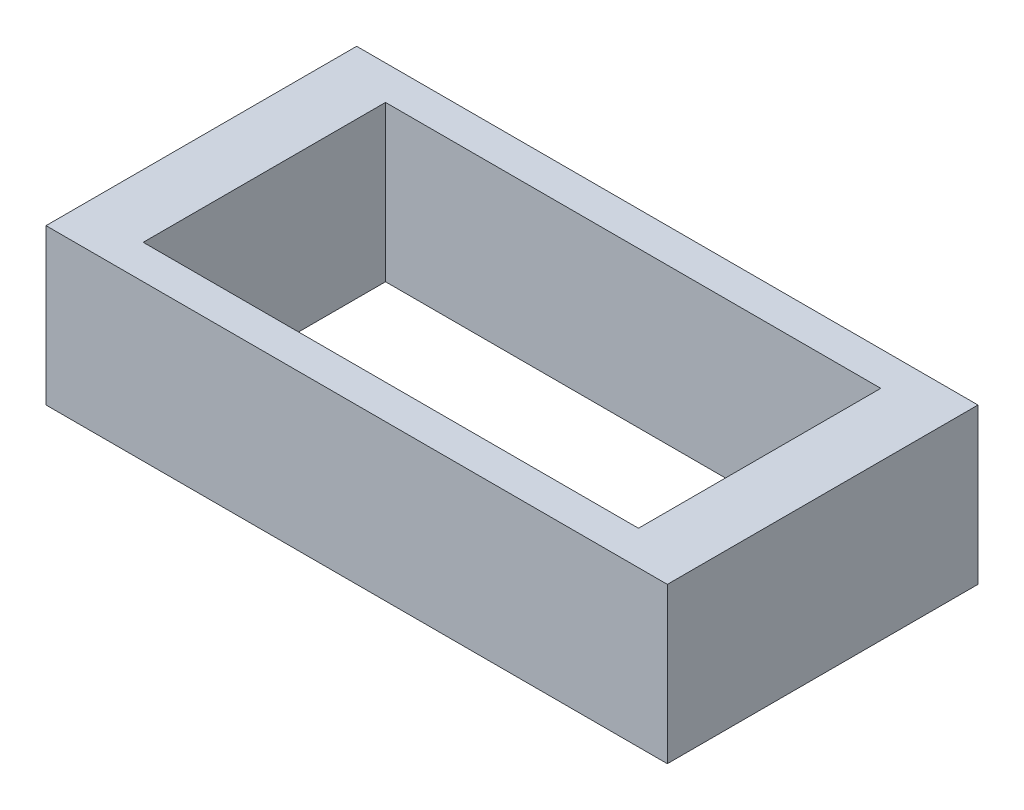
ISO-10303-21;
HEADER;
FILE_DESCRIPTION(('STEP AP214'),'2;1');
FILE_NAME('part.step','',(''),(''),'','','');
FILE_SCHEMA(('AUTOMOTIVE_DESIGN { 1 0 10303 214 1 1 1 1 }'));
ENDSEC;
DATA;
#1=APPLICATION_CONTEXT('core data for automotive mechanical design processes');
#2=APPLICATION_PROTOCOL_DEFINITION('international standard','automotive_design',2000,#1);
#3=PRODUCT_CONTEXT('',#1,'mechanical');
#4=PRODUCT('Part','Part','',(#3));
#5=PRODUCT_RELATED_PRODUCT_CATEGORY('part','',(#4));
#6=PRODUCT_DEFINITION_FORMATION('','',#4);
#7=PRODUCT_DEFINITION_CONTEXT('part definition',#1,'design');
#8=PRODUCT_DEFINITION('design','',#6,#7);
#9=PRODUCT_DEFINITION_SHAPE('','',#8);
#10=(LENGTH_UNIT() NAMED_UNIT(*) SI_UNIT(.MILLI.,.METRE.));
#11=(NAMED_UNIT(*) PLANE_ANGLE_UNIT() SI_UNIT($,.RADIAN.));
#12=(NAMED_UNIT(*) SI_UNIT($,.STERADIAN.) SOLID_ANGLE_UNIT());
#13=UNCERTAINTY_MEASURE_WITH_UNIT(LENGTH_MEASURE(1.E-05),#10,'distance_accuracy_value','');
#14=(GEOMETRIC_REPRESENTATION_CONTEXT(3) GLOBAL_UNCERTAINTY_ASSIGNED_CONTEXT((#13)) GLOBAL_UNIT_ASSIGNED_CONTEXT((#10,
#11,#12)) REPRESENTATION_CONTEXT('',''));
#15=CARTESIAN_POINT('',(0.,0.,0.));
#16=DIRECTION('',(0.,0.,1.));
#17=DIRECTION('',(1.,0.,0.));
#18=AXIS2_PLACEMENT_3D('',#15,#16,#17);
#19=CARTESIAN_POINT('',(0.,12.7,0.));
#20=DIRECTION('',(0.,-1.,0.));
#21=DIRECTION('',(0.,0.,-1.));
#22=AXIS2_PLACEMENT_3D('',#19,#20,#21);
#23=PLANE('',#22);
#24=DIRECTION('',(0.,0.,1.));
#25=VECTOR('',#24,1.);
#26=CARTESIAN_POINT('',(0.,12.7,0.));
#27=LINE('',#26,#25);
#28=CARTESIAN_POINT('',(0.,12.7,-25.4));
#29=VERTEX_POINT('',#28);
#30=CARTESIAN_POINT('',(0.,12.7,0.));
#31=VERTEX_POINT('',#30);
#32=EDGE_CURVE('E134',#29,#31,#27,.T.);
#33=ORIENTED_EDGE('',*,*,#32,.T.);
#34=DIRECTION('',(1.,0.,0.));
#35=VECTOR('',#34,1.);
#36=CARTESIAN_POINT('',(0.,12.7,0.));
#37=LINE('',#36,#35);
#38=CARTESIAN_POINT('',(50.8,12.7,0.));
#39=VERTEX_POINT('',#38);
#40=EDGE_CURVE('E137',#31,#39,#37,.T.);
#41=ORIENTED_EDGE('',*,*,#40,.T.);
#42=DIRECTION('',(0.,0.,-1.));
#43=VECTOR('',#42,1.);
#44=CARTESIAN_POINT('',(50.8,12.7,-25.4));
#45=LINE('',#44,#43);
#46=CARTESIAN_POINT('',(50.8,12.7,-25.4));
#47=VERTEX_POINT('',#46);
#48=EDGE_CURVE('E140',#39,#47,#45,.T.);
#49=ORIENTED_EDGE('',*,*,#48,.T.);
#50=DIRECTION('',(-1.,0.,0.));
#51=VECTOR('',#50,1.);
#52=CARTESIAN_POINT('',(0.,12.7,-25.4));
#53=LINE('',#52,#51);
#54=EDGE_CURVE('E142',#47,#29,#53,.T.);
#55=ORIENTED_EDGE('',*,*,#54,.T.);
#56=EDGE_LOOP('',(#33,#41,#49,#55));
#57=FACE_BOUND('',#56,.T.);
#58=DIRECTION('',(-1.,0.,0.));
#59=VECTOR('',#58,1.);
#60=CARTESIAN_POINT('',(5.15431678641298,12.7,-22.606));
#61=LINE('',#60,#59);
#62=CARTESIAN_POINT('',(45.645683213587,12.7,-22.606));
#63=VERTEX_POINT('',#62);
#64=CARTESIAN_POINT('',(5.15431678641298,12.7,-22.606));
#65=VERTEX_POINT('',#64);
#66=EDGE_CURVE('E98',#63,#65,#61,.T.);
#67=ORIENTED_EDGE('',*,*,#66,.F.);
#68=DIRECTION('',(0.,0.,-1.));
#69=VECTOR('',#68,1.);
#70=CARTESIAN_POINT('',(45.645683213587,12.7,-22.606));
#71=LINE('',#70,#69);
#72=CARTESIAN_POINT('',(45.645683213587,12.7,-2.794));
#73=VERTEX_POINT('',#72);
#74=EDGE_CURVE('E120',#73,#63,#71,.T.);
#75=ORIENTED_EDGE('',*,*,#74,.F.);
#76=DIRECTION('',(1.,0.,0.));
#77=VECTOR('',#76,1.);
#78=CARTESIAN_POINT('',(45.645683213587,12.7,-2.794));
#79=LINE('',#78,#77);
#80=CARTESIAN_POINT('',(5.15431678641298,12.7,-2.794));
#81=VERTEX_POINT('',#80);
#82=EDGE_CURVE('E118',#81,#73,#79,.T.);
#83=ORIENTED_EDGE('',*,*,#82,.F.);
#84=DIRECTION('',(0.,0.,1.));
#85=VECTOR('',#84,1.);
#86=CARTESIAN_POINT('',(5.15431678641298,12.7,-22.606));
#87=LINE('',#86,#85);
#88=EDGE_CURVE('E106',#65,#81,#87,.T.);
#89=ORIENTED_EDGE('',*,*,#88,.F.);
#90=EDGE_LOOP('',(#67,#75,#83,#89));
#91=FACE_BOUND('',#90,.T.);
#92=ADVANCED_FACE('F33',(#57,#91),#23,.F.);
#93=CARTESIAN_POINT('',(0.,0.,0.));
#94=DIRECTION('',(0.,-1.,0.));
#95=DIRECTION('',(0.,0.,-1.));
#96=AXIS2_PLACEMENT_3D('',#93,#94,#95);
#97=PLANE('',#96);
#98=DIRECTION('',(0.,0.,1.));
#99=VECTOR('',#98,1.);
#100=CARTESIAN_POINT('',(0.,0.,0.));
#101=LINE('',#100,#99);
#102=CARTESIAN_POINT('',(0.,0.,-25.4));
#103=VERTEX_POINT('',#102);
#104=CARTESIAN_POINT('',(0.,0.,0.));
#105=VERTEX_POINT('',#104);
#106=EDGE_CURVE('E114',#103,#105,#101,.T.);
#107=ORIENTED_EDGE('',*,*,#106,.F.);
#108=DIRECTION('',(-1.,0.,0.));
#109=VECTOR('',#108,1.);
#110=CARTESIAN_POINT('',(0.,0.,-25.4));
#111=LINE('',#110,#109);
#112=CARTESIAN_POINT('',(50.8,0.,-25.4));
#113=VERTEX_POINT('',#112);
#114=EDGE_CURVE('E138',#113,#103,#111,.T.);
#115=ORIENTED_EDGE('',*,*,#114,.F.);
#116=DIRECTION('',(0.,0.,-1.));
#117=VECTOR('',#116,1.);
#118=CARTESIAN_POINT('',(50.8,0.,-25.4));
#119=LINE('',#118,#117);
#120=CARTESIAN_POINT('',(50.8,0.,0.));
#121=VERTEX_POINT('',#120);
#122=EDGE_CURVE('E149',#121,#113,#119,.T.);
#123=ORIENTED_EDGE('',*,*,#122,.F.);
#124=DIRECTION('',(1.,0.,0.));
#125=VECTOR('',#124,1.);
#126=CARTESIAN_POINT('',(0.,0.,0.));
#127=LINE('',#126,#125);
#128=EDGE_CURVE('E147',#105,#121,#127,.T.);
#129=ORIENTED_EDGE('',*,*,#128,.F.);
#130=EDGE_LOOP('',(#107,#115,#123,#129));
#131=FACE_BOUND('',#130,.T.);
#132=DIRECTION('',(0.,0.,-1.));
#133=VECTOR('',#132,1.);
#134=CARTESIAN_POINT('',(45.645683213587,0.,-22.606));
#135=LINE('',#134,#133);
#136=CARTESIAN_POINT('',(45.645683213587,0.,-2.794));
#137=VERTEX_POINT('',#136);
#138=CARTESIAN_POINT('',(45.645683213587,0.,-22.606));
#139=VERTEX_POINT('',#138);
#140=EDGE_CURVE('E107',#137,#139,#135,.T.);
#141=ORIENTED_EDGE('',*,*,#140,.T.);
#142=DIRECTION('',(-1.,0.,0.));
#143=VECTOR('',#142,1.);
#144=CARTESIAN_POINT('',(5.15431678641298,0.,-22.606));
#145=LINE('',#144,#143);
#146=CARTESIAN_POINT('',(5.15431678641298,0.,-22.606));
#147=VERTEX_POINT('',#146);
#148=EDGE_CURVE('E56',#139,#147,#145,.T.);
#149=ORIENTED_EDGE('',*,*,#148,.T.);
#150=DIRECTION('',(0.,0.,1.));
#151=VECTOR('',#150,1.);
#152=CARTESIAN_POINT('',(5.15431678641298,0.,-22.606));
#153=LINE('',#152,#151);
#154=CARTESIAN_POINT('',(5.15431678641298,0.,-2.794));
#155=VERTEX_POINT('',#154);
#156=EDGE_CURVE('E113',#147,#155,#153,.T.);
#157=ORIENTED_EDGE('',*,*,#156,.T.);
#158=DIRECTION('',(1.,0.,0.));
#159=VECTOR('',#158,1.);
#160=CARTESIAN_POINT('',(45.645683213587,0.,-2.794));
#161=LINE('',#160,#159);
#162=EDGE_CURVE('E126',#155,#137,#161,.T.);
#163=ORIENTED_EDGE('',*,*,#162,.T.);
#164=EDGE_LOOP('',(#141,#149,#157,#163));
#165=FACE_BOUND('',#164,.T.);
#166=ADVANCED_FACE('F167',(#131,#165),#97,.T.);
#167=CARTESIAN_POINT('',(0.,12.7,0.));
#168=DIRECTION('',(1.,0.,0.));
#169=DIRECTION('',(0.,0.,-1.));
#170=AXIS2_PLACEMENT_3D('',#167,#168,#169);
#171=PLANE('',#170);
#172=ORIENTED_EDGE('',*,*,#106,.T.);
#173=DIRECTION('',(0.,-1.,0.));
#174=VECTOR('',#173,1.);
#175=CARTESIAN_POINT('',(0.,12.7,0.));
#176=LINE('',#175,#174);
#177=EDGE_CURVE('E11',#31,#105,#176,.T.);
#178=ORIENTED_EDGE('',*,*,#177,.F.);
#179=ORIENTED_EDGE('',*,*,#32,.F.);
#180=DIRECTION('',(0.,-1.,0.));
#181=VECTOR('',#180,1.);
#182=CARTESIAN_POINT('',(0.,12.7,-25.4));
#183=LINE('',#182,#181);
#184=EDGE_CURVE('E144',#29,#103,#183,.T.);
#185=ORIENTED_EDGE('',*,*,#184,.T.);
#186=EDGE_LOOP('',(#172,#178,#179,#185));
#187=FACE_BOUND('',#186,.T.);
#188=ADVANCED_FACE('F35',(#187),#171,.F.);
#189=CARTESIAN_POINT('',(0.,12.7,0.));
#190=DIRECTION('',(0.,0.,-1.));
#191=DIRECTION('',(-1.,0.,0.));
#192=AXIS2_PLACEMENT_3D('',#189,#190,#191);
#193=PLANE('',#192);
#194=ORIENTED_EDGE('',*,*,#128,.T.);
#195=DIRECTION('',(0.,-1.,0.));
#196=VECTOR('',#195,1.);
#197=CARTESIAN_POINT('',(50.8,12.7,0.));
#198=LINE('',#197,#196);
#199=EDGE_CURVE('E41',#39,#121,#198,.T.);
#200=ORIENTED_EDGE('',*,*,#199,.F.);
#201=ORIENTED_EDGE('',*,*,#40,.F.);
#202=ORIENTED_EDGE('',*,*,#177,.T.);
#203=EDGE_LOOP('',(#194,#200,#201,#202));
#204=FACE_BOUND('',#203,.T.);
#205=ADVANCED_FACE('F177',(#204),#193,.F.);
#206=CARTESIAN_POINT('',(50.8,12.7,-25.4));
#207=DIRECTION('',(-1.,0.,0.));
#208=DIRECTION('',(0.,0.,1.));
#209=AXIS2_PLACEMENT_3D('',#206,#207,#208);
#210=PLANE('',#209);
#211=ORIENTED_EDGE('',*,*,#122,.T.);
#212=DIRECTION('',(0.,-1.,0.));
#213=VECTOR('',#212,1.);
#214=CARTESIAN_POINT('',(50.8,12.7,-25.4));
#215=LINE('',#214,#213);
#216=EDGE_CURVE('E154',#47,#113,#215,.T.);
#217=ORIENTED_EDGE('',*,*,#216,.F.);
#218=ORIENTED_EDGE('',*,*,#48,.F.);
#219=ORIENTED_EDGE('',*,*,#199,.T.);
#220=EDGE_LOOP('',(#211,#217,#218,#219));
#221=FACE_BOUND('',#220,.T.);
#222=ADVANCED_FACE('F161',(#221),#210,.F.);
#223=CARTESIAN_POINT('',(0.,12.7,-25.4));
#224=DIRECTION('',(0.,0.,1.));
#225=DIRECTION('',(1.,0.,0.));
#226=AXIS2_PLACEMENT_3D('',#223,#224,#225);
#227=PLANE('',#226);
#228=ORIENTED_EDGE('',*,*,#114,.T.);
#229=ORIENTED_EDGE('',*,*,#184,.F.);
#230=ORIENTED_EDGE('',*,*,#54,.F.);
#231=ORIENTED_EDGE('',*,*,#216,.T.);
#232=EDGE_LOOP('',(#228,#229,#230,#231));
#233=FACE_BOUND('',#232,.T.);
#234=ADVANCED_FACE('F171',(#233),#227,.F.);
#235=CARTESIAN_POINT('',(5.15431678641298,12.7,-22.606));
#236=DIRECTION('',(0.,0.,1.));
#237=DIRECTION('',(1.,0.,0.));
#238=AXIS2_PLACEMENT_3D('',#235,#236,#237);
#239=PLANE('',#238);
#240=ORIENTED_EDGE('',*,*,#148,.F.);
#241=DIRECTION('',(0.,-1.,0.));
#242=VECTOR('',#241,1.);
#243=CARTESIAN_POINT('',(45.645683213587,12.7,-22.606));
#244=LINE('',#243,#242);
#245=EDGE_CURVE('E102',#63,#139,#244,.T.);
#246=ORIENTED_EDGE('',*,*,#245,.F.);
#247=ORIENTED_EDGE('',*,*,#66,.T.);
#248=DIRECTION('',(0.,-1.,0.));
#249=VECTOR('',#248,1.);
#250=CARTESIAN_POINT('',(5.15431678641298,12.7,-22.606));
#251=LINE('',#250,#249);
#252=EDGE_CURVE('E101',#65,#147,#251,.T.);
#253=ORIENTED_EDGE('',*,*,#252,.T.);
#254=EDGE_LOOP('',(#240,#246,#247,#253));
#255=FACE_BOUND('',#254,.T.);
#256=ADVANCED_FACE('F100',(#255),#239,.T.);
#257=CARTESIAN_POINT('',(5.15431678641298,12.7,-22.606));
#258=DIRECTION('',(1.,0.,0.));
#259=DIRECTION('',(0.,0.,-1.));
#260=AXIS2_PLACEMENT_3D('',#257,#258,#259);
#261=PLANE('',#260);
#262=ORIENTED_EDGE('',*,*,#156,.F.);
#263=ORIENTED_EDGE('',*,*,#252,.F.);
#264=ORIENTED_EDGE('',*,*,#88,.T.);
#265=DIRECTION('',(0.,-1.,0.));
#266=VECTOR('',#265,1.);
#267=CARTESIAN_POINT('',(5.15431678641298,12.7,-2.794));
#268=LINE('',#267,#266);
#269=EDGE_CURVE('E115',#81,#155,#268,.T.);
#270=ORIENTED_EDGE('',*,*,#269,.T.);
#271=EDGE_LOOP('',(#262,#263,#264,#270));
#272=FACE_BOUND('',#271,.T.);
#273=ADVANCED_FACE('F110',(#272),#261,.T.);
#274=CARTESIAN_POINT('',(45.645683213587,12.7,-2.794));
#275=DIRECTION('',(0.,0.,-1.));
#276=DIRECTION('',(-1.,0.,0.));
#277=AXIS2_PLACEMENT_3D('',#274,#275,#276);
#278=PLANE('',#277);
#279=ORIENTED_EDGE('',*,*,#162,.F.);
#280=ORIENTED_EDGE('',*,*,#269,.F.);
#281=ORIENTED_EDGE('',*,*,#82,.T.);
#282=DIRECTION('',(0.,-1.,0.));
#283=VECTOR('',#282,1.);
#284=CARTESIAN_POINT('',(45.645683213587,12.7,-2.794));
#285=LINE('',#284,#283);
#286=EDGE_CURVE('E48',#73,#137,#285,.T.);
#287=ORIENTED_EDGE('',*,*,#286,.T.);
#288=EDGE_LOOP('',(#279,#280,#281,#287));
#289=FACE_BOUND('',#288,.T.);
#290=ADVANCED_FACE('F200',(#289),#278,.T.);
#291=CARTESIAN_POINT('',(45.645683213587,12.7,-22.606));
#292=DIRECTION('',(-1.,0.,0.));
#293=DIRECTION('',(0.,0.,1.));
#294=AXIS2_PLACEMENT_3D('',#291,#292,#293);
#295=PLANE('',#294);
#296=ORIENTED_EDGE('',*,*,#140,.F.);
#297=ORIENTED_EDGE('',*,*,#286,.F.);
#298=ORIENTED_EDGE('',*,*,#74,.T.);
#299=ORIENTED_EDGE('',*,*,#245,.T.);
#300=EDGE_LOOP('',(#296,#297,#298,#299));
#301=FACE_BOUND('',#300,.T.);
#302=ADVANCED_FACE('F204',(#301),#295,.T.);
#303=CLOSED_SHELL('',(#92,#166,#188,#205,#222,#234,#256,#273,#290,#302));
#304=MANIFOLD_SOLID_BREP('B2',#303);
#305=ADVANCED_BREP_SHAPE_REPRESENTATION('',(#18,#304),#14);
#306=SHAPE_DEFINITION_REPRESENTATION(#9,#305);
ENDSEC;
END-ISO-10303-21;
